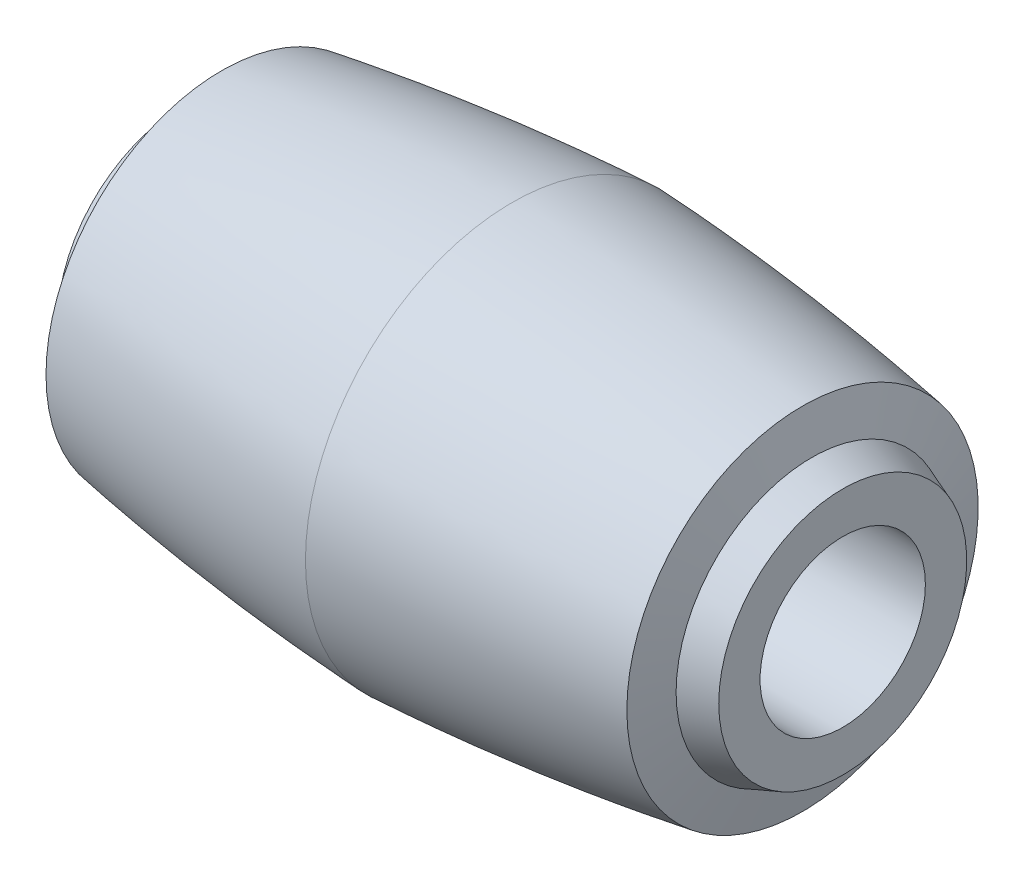
ISO-10303-21;
HEADER;
FILE_DESCRIPTION(('STEP AP214'),'2;1');
FILE_NAME('part.step','',(''),(''),'','','');
FILE_SCHEMA(('AUTOMOTIVE_DESIGN { 1 0 10303 214 1 1 1 1 }'));
ENDSEC;
DATA;
#1=APPLICATION_CONTEXT('core data for automotive mechanical design processes');
#2=APPLICATION_PROTOCOL_DEFINITION('international standard','automotive_design',2000,#1);
#3=PRODUCT_CONTEXT('',#1,'mechanical');
#4=PRODUCT('Part','Part','',(#3));
#5=PRODUCT_RELATED_PRODUCT_CATEGORY('part','',(#4));
#6=PRODUCT_DEFINITION_FORMATION('','',#4);
#7=PRODUCT_DEFINITION_CONTEXT('part definition',#1,'design');
#8=PRODUCT_DEFINITION('design','',#6,#7);
#9=PRODUCT_DEFINITION_SHAPE('','',#8);
#10=(LENGTH_UNIT() NAMED_UNIT(*) SI_UNIT(.MILLI.,.METRE.));
#11=(NAMED_UNIT(*) PLANE_ANGLE_UNIT() SI_UNIT($,.RADIAN.));
#12=(NAMED_UNIT(*) SI_UNIT($,.STERADIAN.) SOLID_ANGLE_UNIT());
#13=UNCERTAINTY_MEASURE_WITH_UNIT(LENGTH_MEASURE(1.E-05),#10,'distance_accuracy_value','');
#14=(GEOMETRIC_REPRESENTATION_CONTEXT(3) GLOBAL_UNCERTAINTY_ASSIGNED_CONTEXT((#13)) GLOBAL_UNIT_ASSIGNED_CONTEXT((#10,
#11,#12)) REPRESENTATION_CONTEXT('',''));
#15=CARTESIAN_POINT('',(0.,0.,0.));
#16=DIRECTION('',(0.,0.,1.));
#17=DIRECTION('',(1.,0.,0.));
#18=AXIS2_PLACEMENT_3D('',#15,#16,#17);
#19=CARTESIAN_POINT('',(14.0541896057571,8.5,0.));
#20=CARTESIAN_POINT('',(7.07746261087578,9.64983272969727,0.));
#21=CARTESIAN_POINT('',(0.,10.,0.));
#22=B_SPLINE_CURVE_WITH_KNOTS('',2,(#19,#20,#21),.UNSPECIFIED.,.F.,.F.,(3,3),(0.,1.),.UNSPECIFIED.);
#23=CARTESIAN_POINT('',(0.,0.,0.));
#24=DIRECTION('',(-1.,0.,0.));
#25=AXIS1_PLACEMENT('',#23,#24);
#26=SURFACE_OF_REVOLUTION('',#22,#25);
#27=CARTESIAN_POINT('',(0.,0.,0.));
#28=DIRECTION('',(-1.,0.,0.));
#29=DIRECTION('',(0.,0.,1.));
#30=AXIS2_PLACEMENT_3D('',#27,#28,#29);
#31=CIRCLE('',#30,10.);
#32=CARTESIAN_POINT('',(0.,0.,10.));
#33=VERTEX_POINT('',#32);
#34=EDGE_CURVE('E10',#33,#33,#31,.T.);
#35=ORIENTED_EDGE('',*,*,#34,.F.);
#36=EDGE_LOOP('',(#35));
#37=FACE_BOUND('',#36,.T.);
#38=CARTESIAN_POINT('',(14.0541896057571,0.,0.));
#39=DIRECTION('',(-1.,0.,0.));
#40=DIRECTION('',(0.,0.,1.));
#41=AXIS2_PLACEMENT_3D('',#38,#39,#40);
#42=CIRCLE('',#41,8.5);
#43=CARTESIAN_POINT('',(14.0541896057571,0.,8.5));
#44=VERTEX_POINT('',#43);
#45=EDGE_CURVE('E45',#44,#44,#42,.T.);
#46=ORIENTED_EDGE('',*,*,#45,.T.);
#47=EDGE_LOOP('',(#46));
#48=FACE_BOUND('',#47,.T.);
#49=ADVANCED_FACE('F30',(#37,#48),#26,.T.);
#50=CARTESIAN_POINT('',(16.,0.,0.));
#51=DIRECTION('',(-1.,0.,0.));
#52=DIRECTION('',(0.,0.,1.));
#53=AXIS2_PLACEMENT_3D('',#50,#51,#52);
#54=PLANE('',#53);
#55=CARTESIAN_POINT('',(16.,0.,0.));
#56=DIRECTION('',(1.,0.,0.));
#57=DIRECTION('',(0.,0.,-1.));
#58=AXIS2_PLACEMENT_3D('',#55,#56,#57);
#59=CIRCLE('',#58,4.);
#60=CARTESIAN_POINT('',(16.,0.,-4.));
#61=VERTEX_POINT('',#60);
#62=EDGE_CURVE('E70',#61,#61,#59,.T.);
#63=ORIENTED_EDGE('',*,*,#62,.F.);
#64=EDGE_LOOP('',(#63));
#65=FACE_BOUND('',#64,.T.);
#66=CARTESIAN_POINT('',(16.,0.,0.));
#67=DIRECTION('',(-1.,0.,0.));
#68=DIRECTION('',(0.,0.,1.));
#69=AXIS2_PLACEMENT_3D('',#66,#67,#68);
#70=CIRCLE('',#69,6.);
#71=CARTESIAN_POINT('',(16.,0.,6.));
#72=VERTEX_POINT('',#71);
#73=EDGE_CURVE('E37',#72,#72,#70,.T.);
#74=ORIENTED_EDGE('',*,*,#73,.F.);
#75=EDGE_LOOP('',(#74));
#76=FACE_BOUND('',#75,.T.);
#77=ADVANCED_FACE('F88',(#65,#76),#54,.F.);
#78=CARTESIAN_POINT('',(16.,0.,0.));
#79=DIRECTION('',(-1.,0.,0.));
#80=DIRECTION('',(0.,0.,1.));
#81=AXIS2_PLACEMENT_3D('',#78,#79,#80);
#82=CONICAL_SURFACE('',#81,6.,0.359610753362254);
#83=CARTESIAN_POINT('',(14.5,0.,0.));
#84=DIRECTION('',(-1.,0.,0.));
#85=DIRECTION('',(0.,0.,1.));
#86=AXIS2_PLACEMENT_3D('',#83,#84,#85);
#87=CIRCLE('',#86,6.56393778294934);
#88=CARTESIAN_POINT('',(14.5,0.,6.56393778294934));
#89=VERTEX_POINT('',#88);
#90=EDGE_CURVE('E41',#89,#89,#87,.T.);
#91=ORIENTED_EDGE('',*,*,#90,.F.);
#92=EDGE_LOOP('',(#91));
#93=FACE_BOUND('',#92,.T.);
#94=ORIENTED_EDGE('',*,*,#73,.T.);
#95=EDGE_LOOP('',(#94));
#96=FACE_BOUND('',#95,.T.);
#97=ADVANCED_FACE('F85',(#93,#96),#82,.T.);
#98=CARTESIAN_POINT('',(14.5,0.,0.));
#99=DIRECTION('',(-1.,0.,0.));
#100=DIRECTION('',(0.,0.,1.));
#101=AXIS2_PLACEMENT_3D('',#98,#99,#100);
#102=CONICAL_SURFACE('',#101,6.56393778294934,1.34447478238845);
#103=ORIENTED_EDGE('',*,*,#45,.F.);
#104=EDGE_LOOP('',(#103));
#105=FACE_BOUND('',#104,.T.);
#106=ORIENTED_EDGE('',*,*,#90,.T.);
#107=EDGE_LOOP('',(#106));
#108=FACE_BOUND('',#107,.T.);
#109=ADVANCED_FACE('F81',(#105,#108),#102,.T.);
#110=CARTESIAN_POINT('',(-14.0541896057571,8.5,0.));
#111=CARTESIAN_POINT('',(-7.07746261087578,9.64983272969727,0.));
#112=CARTESIAN_POINT('',(0.,10.,0.));
#113=B_SPLINE_CURVE_WITH_KNOTS('',2,(#110,#111,#112),.UNSPECIFIED.,.F.,.F.,(3,3),(0.,1.),.UNSPECIFIED.);
#114=CARTESIAN_POINT('',(0.,0.,0.));
#115=DIRECTION('',(1.,0.,0.));
#116=AXIS1_PLACEMENT('',#114,#115);
#117=SURFACE_OF_REVOLUTION('',#113,#116);
#118=ORIENTED_EDGE('',*,*,#34,.T.);
#119=EDGE_LOOP('',(#118));
#120=FACE_BOUND('',#119,.T.);
#121=CARTESIAN_POINT('',(-14.0541896057571,0.,0.));
#122=DIRECTION('',(-1.,0.,0.));
#123=DIRECTION('',(0.,0.,1.));
#124=AXIS2_PLACEMENT_3D('',#121,#122,#123);
#125=CIRCLE('',#124,8.5);
#126=CARTESIAN_POINT('',(-14.0541896057571,0.,8.5));
#127=VERTEX_POINT('',#126);
#128=EDGE_CURVE('E62',#127,#127,#125,.T.);
#129=ORIENTED_EDGE('',*,*,#128,.F.);
#130=EDGE_LOOP('',(#129));
#131=FACE_BOUND('',#130,.T.);
#132=ADVANCED_FACE('F76',(#120,#131),#117,.T.);
#133=CARTESIAN_POINT('',(-16.,0.,0.));
#134=DIRECTION('',(1.,0.,0.));
#135=DIRECTION('',(0.,0.,1.));
#136=AXIS2_PLACEMENT_3D('',#133,#134,#135);
#137=PLANE('',#136);
#138=CARTESIAN_POINT('',(-16.,0.,0.));
#139=DIRECTION('',(1.,0.,0.));
#140=DIRECTION('',(0.,0.,-1.));
#141=AXIS2_PLACEMENT_3D('',#138,#139,#140);
#142=CIRCLE('',#141,4.);
#143=CARTESIAN_POINT('',(-16.,0.,-4.));
#144=VERTEX_POINT('',#143);
#145=EDGE_CURVE('E65',#144,#144,#142,.T.);
#146=ORIENTED_EDGE('',*,*,#145,.T.);
#147=EDGE_LOOP('',(#146));
#148=FACE_BOUND('',#147,.T.);
#149=CARTESIAN_POINT('',(-16.,0.,0.));
#150=DIRECTION('',(-1.,0.,0.));
#151=DIRECTION('',(0.,0.,1.));
#152=AXIS2_PLACEMENT_3D('',#149,#150,#151);
#153=CIRCLE('',#152,6.);
#154=CARTESIAN_POINT('',(-16.,0.,6.));
#155=VERTEX_POINT('',#154);
#156=EDGE_CURVE('E49',#155,#155,#153,.T.);
#157=ORIENTED_EDGE('',*,*,#156,.T.);
#158=EDGE_LOOP('',(#157));
#159=FACE_BOUND('',#158,.T.);
#160=ADVANCED_FACE('F80',(#148,#159),#137,.F.);
#161=CARTESIAN_POINT('',(-16.,0.,0.));
#162=DIRECTION('',(1.,0.,0.));
#163=DIRECTION('',(0.,0.,1.));
#164=AXIS2_PLACEMENT_3D('',#161,#162,#163);
#165=CONICAL_SURFACE('',#164,6.,0.359610753362254);
#166=CARTESIAN_POINT('',(-14.5,0.,0.));
#167=DIRECTION('',(-1.,0.,0.));
#168=DIRECTION('',(0.,0.,1.));
#169=AXIS2_PLACEMENT_3D('',#166,#167,#168);
#170=CIRCLE('',#169,6.56393778294934);
#171=CARTESIAN_POINT('',(-14.5,0.,6.56393778294934));
#172=VERTEX_POINT('',#171);
#173=EDGE_CURVE('E59',#172,#172,#170,.T.);
#174=ORIENTED_EDGE('',*,*,#173,.T.);
#175=EDGE_LOOP('',(#174));
#176=FACE_BOUND('',#175,.T.);
#177=ORIENTED_EDGE('',*,*,#156,.F.);
#178=EDGE_LOOP('',(#177));
#179=FACE_BOUND('',#178,.T.);
#180=ADVANCED_FACE('F112',(#176,#179),#165,.T.);
#181=CARTESIAN_POINT('',(-14.5,0.,0.));
#182=DIRECTION('',(1.,0.,0.));
#183=DIRECTION('',(0.,0.,1.));
#184=AXIS2_PLACEMENT_3D('',#181,#182,#183);
#185=CONICAL_SURFACE('',#184,6.56393778294934,1.34447478238845);
#186=ORIENTED_EDGE('',*,*,#128,.T.);
#187=EDGE_LOOP('',(#186));
#188=FACE_BOUND('',#187,.T.);
#189=ORIENTED_EDGE('',*,*,#173,.F.);
#190=EDGE_LOOP('',(#189));
#191=FACE_BOUND('',#190,.T.);
#192=ADVANCED_FACE('F107',(#188,#191),#185,.T.);
#193=CARTESIAN_POINT('',(-16.,0.,0.));
#194=DIRECTION('',(1.,0.,0.));
#195=DIRECTION('',(0.,0.,-1.));
#196=AXIS2_PLACEMENT_3D('',#193,#194,#195);
#197=CYLINDRICAL_SURFACE('',#196,4.);
#198=ORIENTED_EDGE('',*,*,#145,.F.);
#199=EDGE_LOOP('',(#198));
#200=FACE_BOUND('',#199,.T.);
#201=ORIENTED_EDGE('',*,*,#62,.T.);
#202=EDGE_LOOP('',(#201));
#203=FACE_BOUND('',#202,.T.);
#204=ADVANCED_FACE('F105',(#200,#203),#197,.F.);
#205=CLOSED_SHELL('',(#49,#77,#97,#109,#132,#160,#180,#192,#204));
#206=MANIFOLD_SOLID_BREP('B2',#205);
#207=ADVANCED_BREP_SHAPE_REPRESENTATION('',(#18,#206),#14);
#208=SHAPE_DEFINITION_REPRESENTATION(#9,#207);
ENDSEC;
END-ISO-10303-21;
